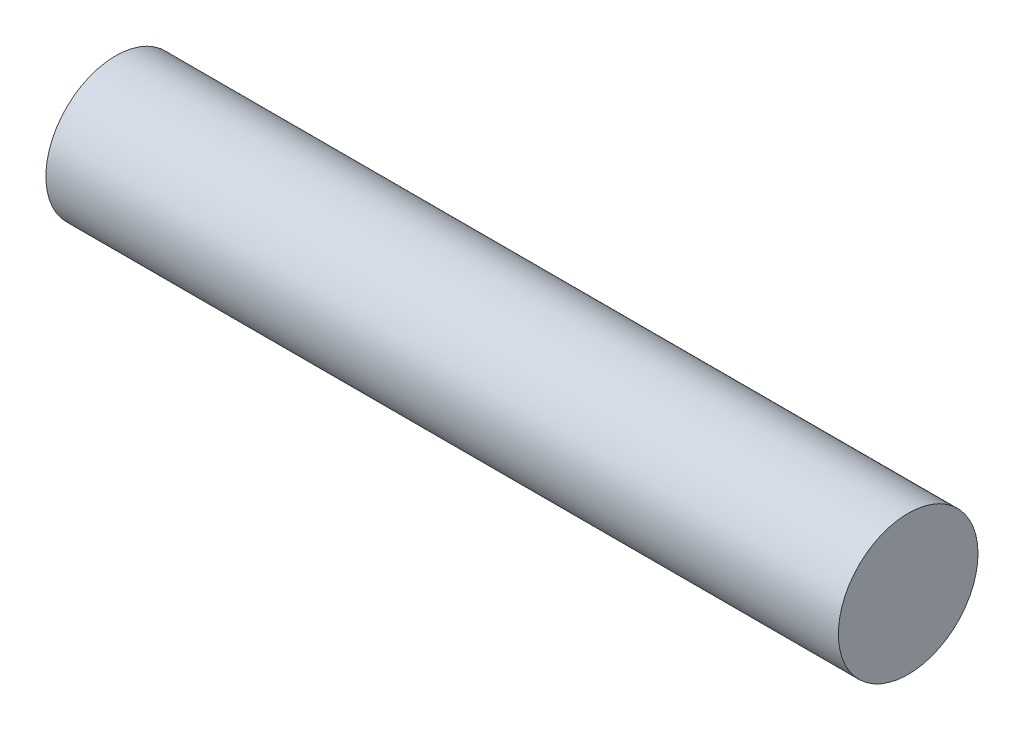
ISO-10303-21;
HEADER;
FILE_DESCRIPTION(('STEP AP214'),'2;1');
FILE_NAME('part.step','',(''),(''),'','','');
FILE_SCHEMA(('AUTOMOTIVE_DESIGN { 1 0 10303 214 1 1 1 1 }'));
ENDSEC;
DATA;
#1=APPLICATION_CONTEXT('core data for automotive mechanical design processes');
#2=APPLICATION_PROTOCOL_DEFINITION('international standard','automotive_design',2000,#1);
#3=PRODUCT_CONTEXT('',#1,'mechanical');
#4=PRODUCT('Part','Part','',(#3));
#5=PRODUCT_RELATED_PRODUCT_CATEGORY('part','',(#4));
#6=PRODUCT_DEFINITION_FORMATION('','',#4);
#7=PRODUCT_DEFINITION_CONTEXT('part definition',#1,'design');
#8=PRODUCT_DEFINITION('design','',#6,#7);
#9=PRODUCT_DEFINITION_SHAPE('','',#8);
#10=(LENGTH_UNIT() NAMED_UNIT(*) SI_UNIT(.MILLI.,.METRE.));
#11=(NAMED_UNIT(*) PLANE_ANGLE_UNIT() SI_UNIT($,.RADIAN.));
#12=(NAMED_UNIT(*) SI_UNIT($,.STERADIAN.) SOLID_ANGLE_UNIT());
#13=UNCERTAINTY_MEASURE_WITH_UNIT(LENGTH_MEASURE(1.E-05),#10,'distance_accuracy_value','');
#14=(GEOMETRIC_REPRESENTATION_CONTEXT(3) GLOBAL_UNCERTAINTY_ASSIGNED_CONTEXT((#13)) GLOBAL_UNIT_ASSIGNED_CONTEXT((#10,
#11,#12)) REPRESENTATION_CONTEXT('',''));
#15=CARTESIAN_POINT('',(0.,0.,0.));
#16=DIRECTION('',(0.,0.,1.));
#17=DIRECTION('',(1.,0.,0.));
#18=AXIS2_PLACEMENT_3D('',#15,#16,#17);
#19=CARTESIAN_POINT('',(79.074518,0.,0.));
#20=DIRECTION('',(-1.,0.,0.));
#21=DIRECTION('',(0.,0.,1.));
#22=AXIS2_PLACEMENT_3D('',#19,#20,#21);
#23=CYLINDRICAL_SURFACE('',#22,13.935202);
#24=CARTESIAN_POINT('',(79.074518,0.,0.));
#25=DIRECTION('',(1.,0.,0.));
#26=DIRECTION('',(0.,0.,-1.));
#27=AXIS2_PLACEMENT_3D('',#24,#25,#26);
#28=CIRCLE('',#27,13.935202);
#29=CARTESIAN_POINT('',(79.074518,0.,-13.935202));
#30=VERTEX_POINT('',#29);
#31=EDGE_CURVE('E10',#30,#30,#28,.T.);
#32=ORIENTED_EDGE('',*,*,#31,.F.);
#33=EDGE_LOOP('',(#32));
#34=FACE_BOUND('',#33,.T.);
#35=CARTESIAN_POINT('',(-79.074518,0.,0.));
#36=DIRECTION('',(1.,0.,0.));
#37=DIRECTION('',(0.,0.,-1.));
#38=AXIS2_PLACEMENT_3D('',#35,#36,#37);
#39=CIRCLE('',#38,13.935202);
#40=CARTESIAN_POINT('',(-79.074518,0.,-13.935202));
#41=VERTEX_POINT('',#40);
#42=EDGE_CURVE('E37',#41,#41,#39,.T.);
#43=ORIENTED_EDGE('',*,*,#42,.T.);
#44=EDGE_LOOP('',(#43));
#45=FACE_BOUND('',#44,.T.);
#46=ADVANCED_FACE('F31',(#34,#45),#23,.T.);
#47=CARTESIAN_POINT('',(79.074518,0.,0.));
#48=DIRECTION('',(1.,0.,0.));
#49=DIRECTION('',(0.,0.,-1.));
#50=AXIS2_PLACEMENT_3D('',#47,#48,#49);
#51=PLANE('',#50);
#52=ORIENTED_EDGE('',*,*,#31,.T.);
#53=EDGE_LOOP('',(#52));
#54=FACE_BOUND('',#53,.T.);
#55=ADVANCED_FACE('F46',(#54),#51,.T.);
#56=CARTESIAN_POINT('',(-79.074518,0.,0.));
#57=DIRECTION('',(1.,0.,0.));
#58=DIRECTION('',(0.,0.,-1.));
#59=AXIS2_PLACEMENT_3D('',#56,#57,#58);
#60=PLANE('',#59);
#61=ORIENTED_EDGE('',*,*,#42,.F.);
#62=EDGE_LOOP('',(#61));
#63=FACE_BOUND('',#62,.T.);
#64=ADVANCED_FACE('F44',(#63),#60,.F.);
#65=CLOSED_SHELL('',(#46,#55,#64));
#66=MANIFOLD_SOLID_BREP('B2',#65);
#67=ADVANCED_BREP_SHAPE_REPRESENTATION('',(#18,#66),#14);
#68=SHAPE_DEFINITION_REPRESENTATION(#9,#67);
ENDSEC;
END-ISO-10303-21;
